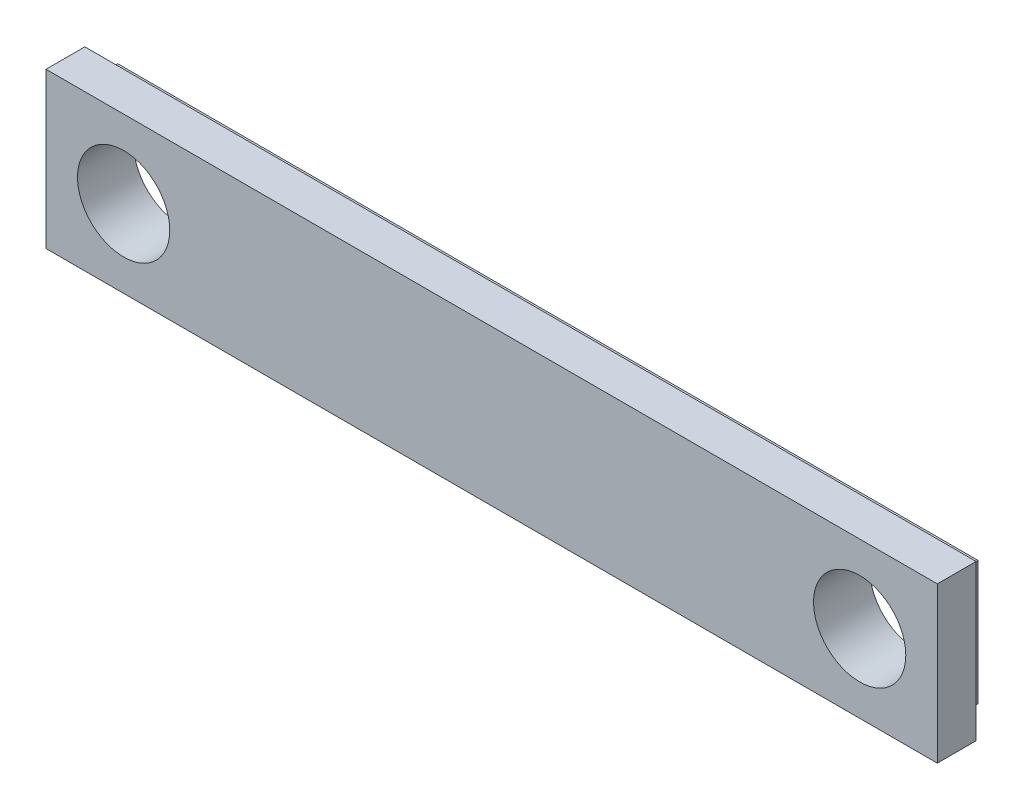
ISO-10303-21;
HEADER;
FILE_DESCRIPTION(('STEP AP214'),'2;1');
FILE_NAME('part.step','',(''),(''),'','','');
FILE_SCHEMA(('AUTOMOTIVE_DESIGN { 1 0 10303 214 1 1 1 1 }'));
ENDSEC;
DATA;
#1=APPLICATION_CONTEXT('core data for automotive mechanical design processes');
#2=APPLICATION_PROTOCOL_DEFINITION('international standard','automotive_design',2000,#1);
#3=PRODUCT_CONTEXT('',#1,'mechanical');
#4=PRODUCT('Part','Part','',(#3));
#5=PRODUCT_RELATED_PRODUCT_CATEGORY('part','',(#4));
#6=PRODUCT_DEFINITION_FORMATION('','',#4);
#7=PRODUCT_DEFINITION_CONTEXT('part definition',#1,'design');
#8=PRODUCT_DEFINITION('design','',#6,#7);
#9=PRODUCT_DEFINITION_SHAPE('','',#8);
#10=(LENGTH_UNIT() NAMED_UNIT(*) SI_UNIT(.MILLI.,.METRE.));
#11=(NAMED_UNIT(*) PLANE_ANGLE_UNIT() SI_UNIT($,.RADIAN.));
#12=(NAMED_UNIT(*) SI_UNIT($,.STERADIAN.) SOLID_ANGLE_UNIT());
#13=UNCERTAINTY_MEASURE_WITH_UNIT(LENGTH_MEASURE(1.E-05),#10,'distance_accuracy_value','');
#14=(GEOMETRIC_REPRESENTATION_CONTEXT(3) GLOBAL_UNCERTAINTY_ASSIGNED_CONTEXT((#13)) GLOBAL_UNIT_ASSIGNED_CONTEXT((#10,
#11,#12)) REPRESENTATION_CONTEXT('',''));
#15=CARTESIAN_POINT('',(0.,0.,0.));
#16=DIRECTION('',(0.,0.,1.));
#17=DIRECTION('',(1.,0.,0.));
#18=AXIS2_PLACEMENT_3D('',#15,#16,#17);
#19=CARTESIAN_POINT('',(0.,0.,0.931976945161728));
#20=DIRECTION('',(0.,0.,1.));
#21=DIRECTION('',(1.,0.,0.));
#22=AXIS2_PLACEMENT_3D('',#19,#20,#21);
#23=PLANE('',#22);
#24=DIRECTION('',(1.,0.,0.));
#25=VECTOR('',#24,1.);
#26=CARTESIAN_POINT('',(161.9,1.99999999950362,0.931976945161728));
#27=LINE('',#26,#25);
#28=CARTESIAN_POINT('',(161.9,1.99999999950362,0.931976945161728));
#29=VERTEX_POINT('',#28);
#30=CARTESIAN_POINT('',(217.300000000142,1.99999999950362,0.931976945161728));
#31=VERTEX_POINT('',#30);
#32=EDGE_CURVE('E144',#29,#31,#27,.T.);
#33=ORIENTED_EDGE('',*,*,#32,.F.);
#34=DIRECTION('',(0.,-1.,0.));
#35=VECTOR('',#34,1.);
#36=CARTESIAN_POINT('',(161.9,1.99999999950362,0.931976945161728));
#37=LINE('',#36,#35);
#38=CARTESIAN_POINT('',(161.9,9.99999999950362,0.931976945161728));
#39=VERTEX_POINT('',#38);
#40=EDGE_CURVE('E71',#39,#29,#37,.T.);
#41=ORIENTED_EDGE('',*,*,#40,.F.);
#42=DIRECTION('',(-1.,0.,0.));
#43=VECTOR('',#42,1.);
#44=CARTESIAN_POINT('',(161.9,9.99999999950362,0.931976945161728));
#45=LINE('',#44,#43);
#46=CARTESIAN_POINT('',(217.300000000142,9.99999999950362,0.931976945161728));
#47=VERTEX_POINT('',#46);
#48=EDGE_CURVE('E66',#47,#39,#45,.T.);
#49=ORIENTED_EDGE('',*,*,#48,.F.);
#50=DIRECTION('',(0.,1.,0.));
#51=VECTOR('',#50,1.);
#52=CARTESIAN_POINT('',(217.300000000142,1.99999999950362,0.931976945161728));
#53=LINE('',#52,#51);
#54=EDGE_CURVE('E158',#31,#47,#53,.T.);
#55=ORIENTED_EDGE('',*,*,#54,.F.);
#56=EDGE_LOOP('',(#33,#41,#49,#55));
#57=FACE_BOUND('',#56,.T.);
#58=CARTESIAN_POINT('',(165.9,5.99999999950362,0.931976945161728));
#59=DIRECTION('',(0.,0.,1.));
#60=DIRECTION('',(1.,0.,0.));
#61=AXIS2_PLACEMENT_3D('',#58,#59,#60);
#62=CIRCLE('',#61,2.97000000014512);
#63=CARTESIAN_POINT('',(168.870000000145,5.99999999950362,0.931976945161728));
#64=VERTEX_POINT('',#63);
#65=EDGE_CURVE('E136',#64,#64,#62,.T.);
#66=ORIENTED_EDGE('',*,*,#65,.T.);
#67=EDGE_LOOP('',(#66));
#68=FACE_BOUND('',#67,.T.);
#69=CARTESIAN_POINT('',(213.300000000142,5.99999999950362,0.931976945161728));
#70=DIRECTION('',(0.,0.,1.));
#71=DIRECTION('',(1.,0.,0.));
#72=AXIS2_PLACEMENT_3D('',#69,#70,#71);
#73=CIRCLE('',#72,2.96999999971727);
#74=CARTESIAN_POINT('',(216.269999999859,5.99999999950362,0.931976945161728));
#75=VERTEX_POINT('',#74);
#76=EDGE_CURVE('E133',#75,#75,#73,.T.);
#77=ORIENTED_EDGE('',*,*,#76,.T.);
#78=EDGE_LOOP('',(#77));
#79=FACE_BOUND('',#78,.T.);
#80=ADVANCED_FACE('F33',(#57,#68,#79),#23,.F.);
#81=CARTESIAN_POINT('',(161.9,1.99999999950362,2.05197694516173));
#82=DIRECTION('',(0.,1.,0.));
#83=DIRECTION('',(0.,0.,1.));
#84=AXIS2_PLACEMENT_3D('',#81,#82,#83);
#85=PLANE('',#84);
#86=ORIENTED_EDGE('',*,*,#32,.T.);
#87=DIRECTION('',(0.,0.,-1.));
#88=VECTOR('',#87,1.);
#89=CARTESIAN_POINT('',(217.300000000142,1.99999999950362,2.05197694516173));
#90=LINE('',#89,#88);
#91=CARTESIAN_POINT('',(217.300000000142,1.99999999950362,2.05197694516173));
#92=VERTEX_POINT('',#91);
#93=EDGE_CURVE('E11',#92,#31,#90,.T.);
#94=ORIENTED_EDGE('',*,*,#93,.F.);
#95=DIRECTION('',(1.,0.,0.));
#96=VECTOR('',#95,1.);
#97=CARTESIAN_POINT('',(161.9,1.99999999950362,2.05197694516173));
#98=LINE('',#97,#96);
#99=CARTESIAN_POINT('',(161.9,1.99999999950362,2.05197694516173));
#100=VERTEX_POINT('',#99);
#101=EDGE_CURVE('E145',#100,#92,#98,.T.);
#102=ORIENTED_EDGE('',*,*,#101,.F.);
#103=DIRECTION('',(0.,0.,-1.));
#104=VECTOR('',#103,1.);
#105=CARTESIAN_POINT('',(161.9,1.99999999950362,2.05197694516173));
#106=LINE('',#105,#104);
#107=EDGE_CURVE('E155',#100,#29,#106,.T.);
#108=ORIENTED_EDGE('',*,*,#107,.T.);
#109=EDGE_LOOP('',(#86,#94,#102,#108));
#110=FACE_BOUND('',#109,.T.);
#111=ADVANCED_FACE('F35',(#110),#85,.F.);
#112=CARTESIAN_POINT('',(217.300000000142,1.99999999950362,2.05197694516173));
#113=DIRECTION('',(-1.,0.,0.));
#114=DIRECTION('',(0.,0.,1.));
#115=AXIS2_PLACEMENT_3D('',#112,#113,#114);
#116=PLANE('',#115);
#117=ORIENTED_EDGE('',*,*,#54,.T.);
#118=DIRECTION('',(0.,0.,-1.));
#119=VECTOR('',#118,1.);
#120=CARTESIAN_POINT('',(217.300000000142,9.99999999950362,2.05197694516173));
#121=LINE('',#120,#119);
#122=CARTESIAN_POINT('',(217.300000000142,9.99999999950362,2.05197694516173));
#123=VERTEX_POINT('',#122);
#124=EDGE_CURVE('E42',#123,#47,#121,.T.);
#125=ORIENTED_EDGE('',*,*,#124,.F.);
#126=DIRECTION('',(0.,1.,0.));
#127=VECTOR('',#126,1.);
#128=CARTESIAN_POINT('',(217.300000000142,1.99999999950362,2.05197694516173));
#129=LINE('',#128,#127);
#130=EDGE_CURVE('E76',#92,#123,#129,.T.);
#131=ORIENTED_EDGE('',*,*,#130,.F.);
#132=ORIENTED_EDGE('',*,*,#93,.T.);
#133=EDGE_LOOP('',(#117,#125,#131,#132));
#134=FACE_BOUND('',#133,.T.);
#135=ADVANCED_FACE('F215',(#134),#116,.F.);
#136=CARTESIAN_POINT('',(161.9,9.99999999950362,2.05197694516173));
#137=DIRECTION('',(0.,-1.,0.));
#138=DIRECTION('',(0.,0.,-1.));
#139=AXIS2_PLACEMENT_3D('',#136,#137,#138);
#140=PLANE('',#139);
#141=ORIENTED_EDGE('',*,*,#48,.T.);
#142=DIRECTION('',(0.,0.,-1.));
#143=VECTOR('',#142,1.);
#144=CARTESIAN_POINT('',(161.9,9.99999999950362,2.05197694516173));
#145=LINE('',#144,#143);
#146=CARTESIAN_POINT('',(161.9,9.99999999950362,2.05197694516173));
#147=VERTEX_POINT('',#146);
#148=EDGE_CURVE('E50',#147,#39,#145,.T.);
#149=ORIENTED_EDGE('',*,*,#148,.F.);
#150=DIRECTION('',(-1.,0.,0.));
#151=VECTOR('',#150,1.);
#152=CARTESIAN_POINT('',(161.9,9.99999999950362,2.05197694516173));
#153=LINE('',#152,#151);
#154=EDGE_CURVE('E149',#123,#147,#153,.T.);
#155=ORIENTED_EDGE('',*,*,#154,.F.);
#156=ORIENTED_EDGE('',*,*,#124,.T.);
#157=EDGE_LOOP('',(#141,#149,#155,#156));
#158=FACE_BOUND('',#157,.T.);
#159=ADVANCED_FACE('F163',(#158),#140,.F.);
#160=CARTESIAN_POINT('',(161.9,1.99999999950362,2.05197694516173));
#161=DIRECTION('',(1.,0.,0.));
#162=DIRECTION('',(0.,0.,-1.));
#163=AXIS2_PLACEMENT_3D('',#160,#161,#162);
#164=PLANE('',#163);
#165=ORIENTED_EDGE('',*,*,#40,.T.);
#166=ORIENTED_EDGE('',*,*,#107,.F.);
#167=DIRECTION('',(0.,-1.,0.));
#168=VECTOR('',#167,1.);
#169=CARTESIAN_POINT('',(161.9,1.99999999950362,2.05197694516173));
#170=LINE('',#169,#168);
#171=EDGE_CURVE('E152',#147,#100,#170,.T.);
#172=ORIENTED_EDGE('',*,*,#171,.F.);
#173=ORIENTED_EDGE('',*,*,#148,.T.);
#174=EDGE_LOOP('',(#165,#166,#172,#173));
#175=FACE_BOUND('',#174,.T.);
#176=ADVANCED_FACE('F168',(#175),#164,.F.);
#177=CARTESIAN_POINT('',(165.9,5.99999999950362,2.05197694516173));
#178=DIRECTION('',(0.,0.,-1.));
#179=DIRECTION('',(-1.,0.,0.));
#180=AXIS2_PLACEMENT_3D('',#177,#178,#179);
#181=CYLINDRICAL_SURFACE('',#180,2.97000000014512);
#182=ORIENTED_EDGE('',*,*,#65,.F.);
#183=EDGE_LOOP('',(#182));
#184=FACE_BOUND('',#183,.T.);
#185=CARTESIAN_POINT('',(165.9,5.99999999950362,4.55197694516173));
#186=DIRECTION('',(0.,0.,1.));
#187=DIRECTION('',(1.,0.,0.));
#188=AXIS2_PLACEMENT_3D('',#185,#186,#187);
#189=CIRCLE('',#188,2.97000000014512);
#190=CARTESIAN_POINT('',(168.870000000145,5.99999999950362,4.55197694516173));
#191=VERTEX_POINT('',#190);
#192=EDGE_CURVE('E182',#191,#191,#189,.T.);
#193=ORIENTED_EDGE('',*,*,#192,.T.);
#194=EDGE_LOOP('',(#193));
#195=FACE_BOUND('',#194,.T.);
#196=ADVANCED_FACE('F200',(#184,#195),#181,.F.);
#197=CARTESIAN_POINT('',(213.300000000142,5.99999999950362,2.05197694516173));
#198=DIRECTION('',(0.,0.,-1.));
#199=DIRECTION('',(-1.,0.,0.));
#200=AXIS2_PLACEMENT_3D('',#197,#198,#199);
#201=CYLINDRICAL_SURFACE('',#200,2.96999999971727);
#202=ORIENTED_EDGE('',*,*,#76,.F.);
#203=EDGE_LOOP('',(#202));
#204=FACE_BOUND('',#203,.T.);
#205=CARTESIAN_POINT('',(213.300000000142,5.99999999950362,4.55197694516173));
#206=DIRECTION('',(0.,0.,1.));
#207=DIRECTION('',(1.,0.,0.));
#208=AXIS2_PLACEMENT_3D('',#205,#206,#207);
#209=CIRCLE('',#208,2.9700000000082);
#210=CARTESIAN_POINT('',(216.27000000015,5.99999999950362,4.55197694516173));
#211=VERTEX_POINT('',#210);
#212=EDGE_CURVE('E177',#211,#211,#209,.T.);
#213=ORIENTED_EDGE('',*,*,#212,.T.);
#214=EDGE_LOOP('',(#213));
#215=FACE_BOUND('',#214,.T.);
#216=ADVANCED_FACE('F203',(#204,#215),#201,.F.);
#217=CARTESIAN_POINT('',(0.,0.,4.55197694516173));
#218=DIRECTION('',(0.,0.,-1.));
#219=DIRECTION('',(-1.,0.,0.));
#220=AXIS2_PLACEMENT_3D('',#217,#218,#219);
#221=PLANE('',#220);
#222=DIRECTION('',(0.,-1.,0.));
#223=VECTOR('',#222,1.);
#224=CARTESIAN_POINT('',(160.9,0.999999999503621,4.55197694516173));
#225=LINE('',#224,#223);
#226=CARTESIAN_POINT('',(160.9,10.9999999995036,4.55197694516173));
#227=VERTEX_POINT('',#226);
#228=CARTESIAN_POINT('',(160.9,0.999999999503621,4.55197694516173));
#229=VERTEX_POINT('',#228);
#230=EDGE_CURVE('E118',#227,#229,#225,.T.);
#231=ORIENTED_EDGE('',*,*,#230,.T.);
#232=DIRECTION('',(1.,0.,0.));
#233=VECTOR('',#232,1.);
#234=CARTESIAN_POINT('',(160.9,0.999999999503621,4.55197694516173));
#235=LINE('',#234,#233);
#236=CARTESIAN_POINT('',(218.300000000141,0.999999999503621,4.55197694516173));
#237=VERTEX_POINT('',#236);
#238=EDGE_CURVE('E107',#229,#237,#235,.T.);
#239=ORIENTED_EDGE('',*,*,#238,.T.);
#240=DIRECTION('',(0.,1.,0.));
#241=VECTOR('',#240,1.);
#242=CARTESIAN_POINT('',(218.300000000141,0.999999999503621,4.55197694516173));
#243=LINE('',#242,#241);
#244=CARTESIAN_POINT('',(218.300000000141,10.9999999995036,4.55197694516173));
#245=VERTEX_POINT('',#244);
#246=EDGE_CURVE('E117',#237,#245,#243,.T.);
#247=ORIENTED_EDGE('',*,*,#246,.T.);
#248=DIRECTION('',(-1.,0.,0.));
#249=VECTOR('',#248,1.);
#250=CARTESIAN_POINT('',(160.9,10.9999999995036,4.55197694516173));
#251=LINE('',#250,#249);
#252=EDGE_CURVE('E124',#245,#227,#251,.T.);
#253=ORIENTED_EDGE('',*,*,#252,.T.);
#254=EDGE_LOOP('',(#231,#239,#247,#253));
#255=FACE_BOUND('',#254,.T.);
#256=ORIENTED_EDGE('',*,*,#212,.F.);
#257=EDGE_LOOP('',(#256));
#258=FACE_BOUND('',#257,.T.);
#259=ORIENTED_EDGE('',*,*,#192,.F.);
#260=EDGE_LOOP('',(#259));
#261=FACE_BOUND('',#260,.T.);
#262=ADVANCED_FACE('F121',(#255,#258,#261),#221,.F.);
#263=CARTESIAN_POINT('',(0.,0.,2.05197694516173));
#264=DIRECTION('',(0.,0.,-1.));
#265=DIRECTION('',(-1.,0.,0.));
#266=AXIS2_PLACEMENT_3D('',#263,#264,#265);
#267=PLANE('',#266);
#268=ORIENTED_EDGE('',*,*,#171,.T.);
#269=ORIENTED_EDGE('',*,*,#101,.T.);
#270=ORIENTED_EDGE('',*,*,#130,.T.);
#271=ORIENTED_EDGE('',*,*,#154,.T.);
#272=EDGE_LOOP('',(#268,#269,#270,#271));
#273=FACE_BOUND('',#272,.T.);
#274=DIRECTION('',(0.,-1.,0.));
#275=VECTOR('',#274,1.);
#276=CARTESIAN_POINT('',(160.9,0.999999999503621,2.05197694516173));
#277=LINE('',#276,#275);
#278=CARTESIAN_POINT('',(160.9,10.9999999995036,2.05197694516173));
#279=VERTEX_POINT('',#278);
#280=CARTESIAN_POINT('',(160.9,0.999999999503621,2.05197694516173));
#281=VERTEX_POINT('',#280);
#282=EDGE_CURVE('E132',#279,#281,#277,.T.);
#283=ORIENTED_EDGE('',*,*,#282,.F.);
#284=DIRECTION('',(-1.,0.,0.));
#285=VECTOR('',#284,1.);
#286=CARTESIAN_POINT('',(160.9,10.9999999995036,2.05197694516173));
#287=LINE('',#286,#285);
#288=CARTESIAN_POINT('',(218.300000000141,10.9999999995036,2.05197694516173));
#289=VERTEX_POINT('',#288);
#290=EDGE_CURVE('E128',#289,#279,#287,.T.);
#291=ORIENTED_EDGE('',*,*,#290,.F.);
#292=DIRECTION('',(0.,1.,0.));
#293=VECTOR('',#292,1.);
#294=CARTESIAN_POINT('',(218.300000000141,0.999999999503621,2.05197694516173));
#295=LINE('',#294,#293);
#296=CARTESIAN_POINT('',(218.300000000141,0.999999999503621,2.05197694516173));
#297=VERTEX_POINT('',#296);
#298=EDGE_CURVE('E179',#297,#289,#295,.T.);
#299=ORIENTED_EDGE('',*,*,#298,.F.);
#300=DIRECTION('',(1.,0.,0.));
#301=VECTOR('',#300,1.);
#302=CARTESIAN_POINT('',(160.9,0.999999999503621,2.05197694516173));
#303=LINE('',#302,#301);
#304=EDGE_CURVE('E176',#281,#297,#303,.T.);
#305=ORIENTED_EDGE('',*,*,#304,.F.);
#306=EDGE_LOOP('',(#283,#291,#299,#305));
#307=FACE_BOUND('',#306,.T.);
#308=ADVANCED_FACE('F170',(#273,#307),#267,.T.);
#309=CARTESIAN_POINT('',(160.9,0.999999999503621,4.55197694516173));
#310=DIRECTION('',(1.,0.,0.));
#311=DIRECTION('',(0.,0.,-1.));
#312=AXIS2_PLACEMENT_3D('',#309,#310,#311);
#313=PLANE('',#312);
#314=ORIENTED_EDGE('',*,*,#282,.T.);
#315=DIRECTION('',(0.,0.,-1.));
#316=VECTOR('',#315,1.);
#317=CARTESIAN_POINT('',(160.9,0.999999999503621,4.55197694516173));
#318=LINE('',#317,#316);
#319=EDGE_CURVE('E111',#229,#281,#318,.T.);
#320=ORIENTED_EDGE('',*,*,#319,.F.);
#321=ORIENTED_EDGE('',*,*,#230,.F.);
#322=DIRECTION('',(0.,0.,-1.));
#323=VECTOR('',#322,1.);
#324=CARTESIAN_POINT('',(160.9,10.9999999995036,4.55197694516173));
#325=LINE('',#324,#323);
#326=EDGE_CURVE('E189',#227,#279,#325,.T.);
#327=ORIENTED_EDGE('',*,*,#326,.T.);
#328=EDGE_LOOP('',(#314,#320,#321,#327));
#329=FACE_BOUND('',#328,.T.);
#330=ADVANCED_FACE('F130',(#329),#313,.F.);
#331=CARTESIAN_POINT('',(160.9,0.999999999503621,4.55197694516173));
#332=DIRECTION('',(0.,1.,0.));
#333=DIRECTION('',(0.,0.,1.));
#334=AXIS2_PLACEMENT_3D('',#331,#332,#333);
#335=PLANE('',#334);
#336=ORIENTED_EDGE('',*,*,#304,.T.);
#337=DIRECTION('',(0.,0.,-1.));
#338=VECTOR('',#337,1.);
#339=CARTESIAN_POINT('',(218.300000000141,0.999999999503621,4.55197694516173));
#340=LINE('',#339,#338);
#341=EDGE_CURVE('E114',#237,#297,#340,.T.);
#342=ORIENTED_EDGE('',*,*,#341,.F.);
#343=ORIENTED_EDGE('',*,*,#238,.F.);
#344=ORIENTED_EDGE('',*,*,#319,.T.);
#345=EDGE_LOOP('',(#336,#342,#343,#344));
#346=FACE_BOUND('',#345,.T.);
#347=ADVANCED_FACE('F109',(#346),#335,.F.);
#348=CARTESIAN_POINT('',(218.300000000141,0.999999999503621,4.55197694516173));
#349=DIRECTION('',(-1.,0.,0.));
#350=DIRECTION('',(0.,0.,1.));
#351=AXIS2_PLACEMENT_3D('',#348,#349,#350);
#352=PLANE('',#351);
#353=ORIENTED_EDGE('',*,*,#298,.T.);
#354=DIRECTION('',(0.,0.,-1.));
#355=VECTOR('',#354,1.);
#356=CARTESIAN_POINT('',(218.300000000141,10.9999999995036,4.55197694516173));
#357=LINE('',#356,#355);
#358=EDGE_CURVE('E138',#245,#289,#357,.T.);
#359=ORIENTED_EDGE('',*,*,#358,.F.);
#360=ORIENTED_EDGE('',*,*,#246,.F.);
#361=ORIENTED_EDGE('',*,*,#341,.T.);
#362=EDGE_LOOP('',(#353,#359,#360,#361));
#363=FACE_BOUND('',#362,.T.);
#364=ADVANCED_FACE('F195',(#363),#352,.F.);
#365=CARTESIAN_POINT('',(160.9,10.9999999995036,4.55197694516173));
#366=DIRECTION('',(0.,-1.,0.));
#367=DIRECTION('',(0.,0.,-1.));
#368=AXIS2_PLACEMENT_3D('',#365,#366,#367);
#369=PLANE('',#368);
#370=ORIENTED_EDGE('',*,*,#290,.T.);
#371=ORIENTED_EDGE('',*,*,#326,.F.);
#372=ORIENTED_EDGE('',*,*,#252,.F.);
#373=ORIENTED_EDGE('',*,*,#358,.T.);
#374=EDGE_LOOP('',(#370,#371,#372,#373));
#375=FACE_BOUND('',#374,.T.);
#376=ADVANCED_FACE('F193',(#375),#369,.F.);
#377=CLOSED_SHELL('',(#80,#111,#135,#159,#176,#196,#216,#262,#308,#330,#347,#364,#376));
#378=MANIFOLD_SOLID_BREP('B2',#377);
#379=ADVANCED_BREP_SHAPE_REPRESENTATION('',(#18,#378),#14);
#380=SHAPE_DEFINITION_REPRESENTATION(#9,#379);
ENDSEC;
END-ISO-10303-21;
